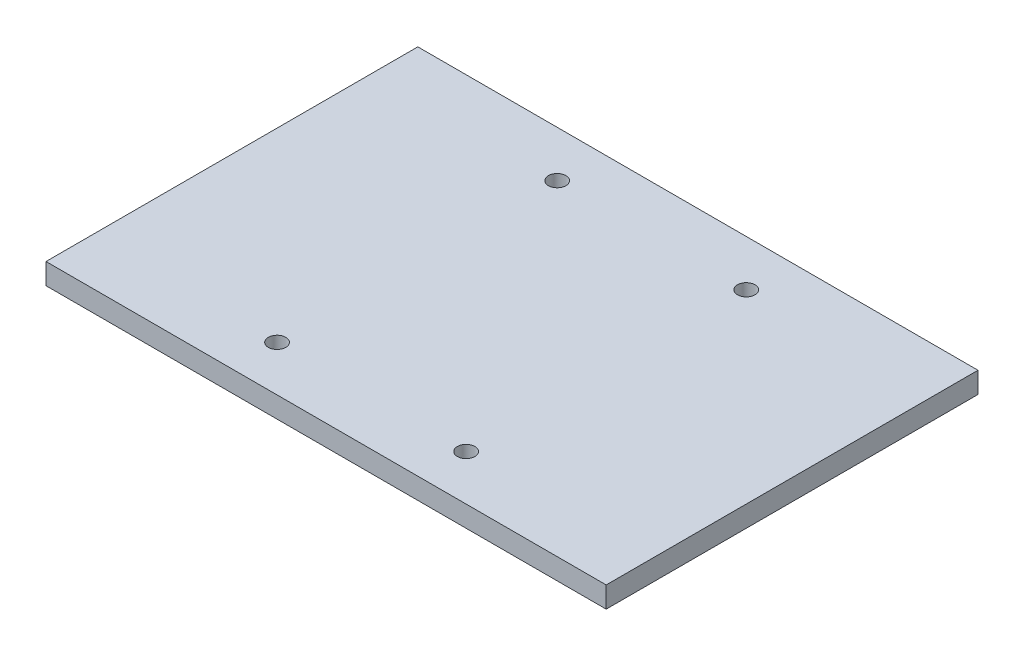
ISO-10303-21;
HEADER;
FILE_DESCRIPTION(('STEP AP214'),'2;1');
FILE_NAME('part.step','',(''),(''),'','','');
FILE_SCHEMA(('AUTOMOTIVE_DESIGN { 1 0 10303 214 1 1 1 1 }'));
ENDSEC;
DATA;
#1=APPLICATION_CONTEXT('core data for automotive mechanical design processes');
#2=APPLICATION_PROTOCOL_DEFINITION('international standard','automotive_design',2000,#1);
#3=PRODUCT_CONTEXT('',#1,'mechanical');
#4=PRODUCT('Part','Part','',(#3));
#5=PRODUCT_RELATED_PRODUCT_CATEGORY('part','',(#4));
#6=PRODUCT_DEFINITION_FORMATION('','',#4);
#7=PRODUCT_DEFINITION_CONTEXT('part definition',#1,'design');
#8=PRODUCT_DEFINITION('design','',#6,#7);
#9=PRODUCT_DEFINITION_SHAPE('','',#8);
#10=(LENGTH_UNIT() NAMED_UNIT(*) SI_UNIT(.MILLI.,.METRE.));
#11=(NAMED_UNIT(*) PLANE_ANGLE_UNIT() SI_UNIT($,.RADIAN.));
#12=(NAMED_UNIT(*) SI_UNIT($,.STERADIAN.) SOLID_ANGLE_UNIT());
#13=UNCERTAINTY_MEASURE_WITH_UNIT(LENGTH_MEASURE(1.E-05),#10,'distance_accuracy_value','');
#14=(GEOMETRIC_REPRESENTATION_CONTEXT(3) GLOBAL_UNCERTAINTY_ASSIGNED_CONTEXT((#13)) GLOBAL_UNIT_ASSIGNED_CONTEXT((#10,
#11,#12)) REPRESENTATION_CONTEXT('',''));
#15=CARTESIAN_POINT('',(0.,0.,0.));
#16=DIRECTION('',(0.,0.,1.));
#17=DIRECTION('',(1.,0.,0.));
#18=AXIS2_PLACEMENT_3D('',#15,#16,#17);
#19=CARTESIAN_POINT('',(0.,3.,0.));
#20=DIRECTION('',(0.,-1.,0.));
#21=DIRECTION('',(0.,0.,-1.));
#22=AXIS2_PLACEMENT_3D('',#19,#20,#21);
#23=PLANE('',#22);
#24=CARTESIAN_POINT('',(26.5,3.,-6.5));
#25=DIRECTION('',(0.,1.,0.));
#26=DIRECTION('',(0.,0.,1.));
#27=AXIS2_PLACEMENT_3D('',#24,#25,#26);
#28=CIRCLE('',#27,1.24999999999999);
#29=CARTESIAN_POINT('',(26.5,3.,-5.25000000000001));
#30=VERTEX_POINT('',#29);
#31=EDGE_CURVE('E135',#30,#30,#28,.T.);
#32=ORIENTED_EDGE('',*,*,#31,.F.);
#33=EDGE_LOOP('',(#32));
#34=FACE_BOUND('',#33,.T.);
#35=CARTESIAN_POINT('',(53.5,3.,-6.5));
#36=DIRECTION('',(0.,1.,0.));
#37=DIRECTION('',(0.,0.,1.));
#38=AXIS2_PLACEMENT_3D('',#35,#36,#37);
#39=CIRCLE('',#38,1.24999999999999);
#40=CARTESIAN_POINT('',(53.5,3.,-5.25000000000001));
#41=VERTEX_POINT('',#40);
#42=EDGE_CURVE('E117',#41,#41,#39,.T.);
#43=ORIENTED_EDGE('',*,*,#42,.F.);
#44=EDGE_LOOP('',(#43));
#45=FACE_BOUND('',#44,.T.);
#46=DIRECTION('',(0.,0.,1.));
#47=VECTOR('',#46,1.);
#48=CARTESIAN_POINT('',(0.,3.,0.));
#49=LINE('',#48,#47);
#50=CARTESIAN_POINT('',(0.,3.,-53.1));
#51=VERTEX_POINT('',#50);
#52=CARTESIAN_POINT('',(0.,3.,0.));
#53=VERTEX_POINT('',#52);
#54=EDGE_CURVE('E89',#51,#53,#49,.T.);
#55=ORIENTED_EDGE('',*,*,#54,.T.);
#56=DIRECTION('',(1.,0.,0.));
#57=VECTOR('',#56,1.);
#58=CARTESIAN_POINT('',(0.,3.,0.));
#59=LINE('',#58,#57);
#60=CARTESIAN_POINT('',(80.,3.,0.));
#61=VERTEX_POINT('',#60);
#62=EDGE_CURVE('E84',#53,#61,#59,.T.);
#63=ORIENTED_EDGE('',*,*,#62,.T.);
#64=DIRECTION('',(0.,0.,-1.));
#65=VECTOR('',#64,1.);
#66=CARTESIAN_POINT('',(80.,3.,0.));
#67=LINE('',#66,#65);
#68=CARTESIAN_POINT('',(80.,3.,-53.1));
#69=VERTEX_POINT('',#68);
#70=EDGE_CURVE('E87',#61,#69,#67,.T.);
#71=ORIENTED_EDGE('',*,*,#70,.T.);
#72=DIRECTION('',(-1.,0.,0.));
#73=VECTOR('',#72,1.);
#74=CARTESIAN_POINT('',(0.,3.,-53.1));
#75=LINE('',#74,#73);
#76=EDGE_CURVE('E54',#69,#51,#75,.T.);
#77=ORIENTED_EDGE('',*,*,#76,.T.);
#78=EDGE_LOOP('',(#55,#63,#71,#77));
#79=FACE_BOUND('',#78,.T.);
#80=CARTESIAN_POINT('',(53.5,3.,-46.5));
#81=DIRECTION('',(0.,1.,0.));
#82=DIRECTION('',(0.,0.,1.));
#83=AXIS2_PLACEMENT_3D('',#80,#81,#82);
#84=CIRCLE('',#83,1.24999999999999);
#85=CARTESIAN_POINT('',(53.5,3.,-45.25));
#86=VERTEX_POINT('',#85);
#87=EDGE_CURVE('E123',#86,#86,#84,.T.);
#88=ORIENTED_EDGE('',*,*,#87,.F.);
#89=EDGE_LOOP('',(#88));
#90=FACE_BOUND('',#89,.T.);
#91=CARTESIAN_POINT('',(26.5,3.,-46.5));
#92=DIRECTION('',(0.,1.,0.));
#93=DIRECTION('',(0.,0.,1.));
#94=AXIS2_PLACEMENT_3D('',#91,#92,#93);
#95=CIRCLE('',#94,1.24999999999999);
#96=CARTESIAN_POINT('',(26.5,3.,-45.25));
#97=VERTEX_POINT('',#96);
#98=EDGE_CURVE('E129',#97,#97,#95,.T.);
#99=ORIENTED_EDGE('',*,*,#98,.F.);
#100=EDGE_LOOP('',(#99));
#101=FACE_BOUND('',#100,.T.);
#102=ADVANCED_FACE('F37',(#34,#45,#79,#90,#101),#23,.F.);
#103=CARTESIAN_POINT('',(0.,3.,0.));
#104=DIRECTION('',(1.,0.,0.));
#105=DIRECTION('',(0.,0.,-1.));
#106=AXIS2_PLACEMENT_3D('',#103,#104,#105);
#107=PLANE('',#106);
#108=DIRECTION('',(0.,0.,1.));
#109=VECTOR('',#108,1.);
#110=CARTESIAN_POINT('',(0.,0.,0.));
#111=LINE('',#110,#109);
#112=CARTESIAN_POINT('',(0.,0.,-53.1));
#113=VERTEX_POINT('',#112);
#114=CARTESIAN_POINT('',(0.,0.,0.));
#115=VERTEX_POINT('',#114);
#116=EDGE_CURVE('E101',#113,#115,#111,.T.);
#117=ORIENTED_EDGE('',*,*,#116,.T.);
#118=DIRECTION('',(0.,-1.,0.));
#119=VECTOR('',#118,1.);
#120=CARTESIAN_POINT('',(0.,3.,0.));
#121=LINE('',#120,#119);
#122=EDGE_CURVE('E11',#53,#115,#121,.T.);
#123=ORIENTED_EDGE('',*,*,#122,.F.);
#124=ORIENTED_EDGE('',*,*,#54,.F.);
#125=DIRECTION('',(0.,-1.,0.));
#126=VECTOR('',#125,1.);
#127=CARTESIAN_POINT('',(0.,3.,-53.1));
#128=LINE('',#127,#126);
#129=EDGE_CURVE('E97',#51,#113,#128,.T.);
#130=ORIENTED_EDGE('',*,*,#129,.T.);
#131=EDGE_LOOP('',(#117,#123,#124,#130));
#132=FACE_BOUND('',#131,.T.);
#133=ADVANCED_FACE('F39',(#132),#107,.F.);
#134=CARTESIAN_POINT('',(0.,3.,0.));
#135=DIRECTION('',(0.,0.,-1.));
#136=DIRECTION('',(-1.,0.,0.));
#137=AXIS2_PLACEMENT_3D('',#134,#135,#136);
#138=PLANE('',#137);
#139=DIRECTION('',(1.,0.,0.));
#140=VECTOR('',#139,1.);
#141=CARTESIAN_POINT('',(0.,0.,0.));
#142=LINE('',#141,#140);
#143=CARTESIAN_POINT('',(80.,0.,0.));
#144=VERTEX_POINT('',#143);
#145=EDGE_CURVE('E93',#115,#144,#142,.T.);
#146=ORIENTED_EDGE('',*,*,#145,.T.);
#147=DIRECTION('',(0.,-1.,0.));
#148=VECTOR('',#147,1.);
#149=CARTESIAN_POINT('',(80.,3.,0.));
#150=LINE('',#149,#148);
#151=EDGE_CURVE('E46',#61,#144,#150,.T.);
#152=ORIENTED_EDGE('',*,*,#151,.F.);
#153=ORIENTED_EDGE('',*,*,#62,.F.);
#154=ORIENTED_EDGE('',*,*,#122,.T.);
#155=EDGE_LOOP('',(#146,#152,#153,#154));
#156=FACE_BOUND('',#155,.T.);
#157=ADVANCED_FACE('F92',(#156),#138,.F.);
#158=CARTESIAN_POINT('',(80.,3.,0.));
#159=DIRECTION('',(-1.,0.,0.));
#160=DIRECTION('',(0.,0.,1.));
#161=AXIS2_PLACEMENT_3D('',#158,#159,#160);
#162=PLANE('',#161);
#163=DIRECTION('',(0.,0.,-1.));
#164=VECTOR('',#163,1.);
#165=CARTESIAN_POINT('',(80.,0.,0.));
#166=LINE('',#165,#164);
#167=CARTESIAN_POINT('',(80.,0.,-53.1));
#168=VERTEX_POINT('',#167);
#169=EDGE_CURVE('E71',#144,#168,#166,.T.);
#170=ORIENTED_EDGE('',*,*,#169,.T.);
#171=DIRECTION('',(0.,-1.,0.));
#172=VECTOR('',#171,1.);
#173=CARTESIAN_POINT('',(80.,3.,-53.1));
#174=LINE('',#173,#172);
#175=EDGE_CURVE('E94',#69,#168,#174,.T.);
#176=ORIENTED_EDGE('',*,*,#175,.F.);
#177=ORIENTED_EDGE('',*,*,#70,.F.);
#178=ORIENTED_EDGE('',*,*,#151,.T.);
#179=EDGE_LOOP('',(#170,#176,#177,#178));
#180=FACE_BOUND('',#179,.T.);
#181=ADVANCED_FACE('F95',(#180),#162,.F.);
#182=CARTESIAN_POINT('',(0.,3.,-53.1));
#183=DIRECTION('',(0.,0.,1.));
#184=DIRECTION('',(1.,0.,0.));
#185=AXIS2_PLACEMENT_3D('',#182,#183,#184);
#186=PLANE('',#185);
#187=DIRECTION('',(-1.,0.,0.));
#188=VECTOR('',#187,1.);
#189=CARTESIAN_POINT('',(0.,0.,-53.1));
#190=LINE('',#189,#188);
#191=EDGE_CURVE('E77',#168,#113,#190,.T.);
#192=ORIENTED_EDGE('',*,*,#191,.T.);
#193=ORIENTED_EDGE('',*,*,#129,.F.);
#194=ORIENTED_EDGE('',*,*,#76,.F.);
#195=ORIENTED_EDGE('',*,*,#175,.T.);
#196=EDGE_LOOP('',(#192,#193,#194,#195));
#197=FACE_BOUND('',#196,.T.);
#198=ADVANCED_FACE('F109',(#197),#186,.F.);
#199=CARTESIAN_POINT('',(0.,0.,0.));
#200=DIRECTION('',(0.,-1.,0.));
#201=DIRECTION('',(0.,0.,-1.));
#202=AXIS2_PLACEMENT_3D('',#199,#200,#201);
#203=PLANE('',#202);
#204=CARTESIAN_POINT('',(26.5,0.,-6.5));
#205=DIRECTION('',(0.,-1.,0.));
#206=DIRECTION('',(0.,0.,-1.));
#207=AXIS2_PLACEMENT_3D('',#204,#205,#206);
#208=CIRCLE('',#207,1.24999999999999);
#209=CARTESIAN_POINT('',(26.5,0.,-7.74999999999999));
#210=VERTEX_POINT('',#209);
#211=EDGE_CURVE('E132',#210,#210,#208,.T.);
#212=ORIENTED_EDGE('',*,*,#211,.F.);
#213=EDGE_LOOP('',(#212));
#214=FACE_BOUND('',#213,.T.);
#215=CARTESIAN_POINT('',(26.5,0.,-46.5));
#216=DIRECTION('',(0.,-1.,0.));
#217=DIRECTION('',(0.,0.,-1.));
#218=AXIS2_PLACEMENT_3D('',#215,#216,#217);
#219=CIRCLE('',#218,1.24999999999999);
#220=CARTESIAN_POINT('',(26.5,0.,-47.75));
#221=VERTEX_POINT('',#220);
#222=EDGE_CURVE('E126',#221,#221,#219,.T.);
#223=ORIENTED_EDGE('',*,*,#222,.F.);
#224=EDGE_LOOP('',(#223));
#225=FACE_BOUND('',#224,.T.);
#226=CARTESIAN_POINT('',(53.5,0.,-46.5));
#227=DIRECTION('',(0.,-1.,0.));
#228=DIRECTION('',(0.,0.,-1.));
#229=AXIS2_PLACEMENT_3D('',#226,#227,#228);
#230=CIRCLE('',#229,1.24999999999999);
#231=CARTESIAN_POINT('',(53.5,0.,-47.75));
#232=VERTEX_POINT('',#231);
#233=EDGE_CURVE('E120',#232,#232,#230,.T.);
#234=ORIENTED_EDGE('',*,*,#233,.F.);
#235=EDGE_LOOP('',(#234));
#236=FACE_BOUND('',#235,.T.);
#237=CARTESIAN_POINT('',(53.5,0.,-6.5));
#238=DIRECTION('',(0.,-1.,0.));
#239=DIRECTION('',(0.,0.,-1.));
#240=AXIS2_PLACEMENT_3D('',#237,#238,#239);
#241=CIRCLE('',#240,1.24999999999999);
#242=CARTESIAN_POINT('',(53.5,0.,-7.74999999999999));
#243=VERTEX_POINT('',#242);
#244=EDGE_CURVE('E104',#243,#243,#241,.T.);
#245=ORIENTED_EDGE('',*,*,#244,.F.);
#246=EDGE_LOOP('',(#245));
#247=FACE_BOUND('',#246,.T.);
#248=ORIENTED_EDGE('',*,*,#116,.F.);
#249=ORIENTED_EDGE('',*,*,#191,.F.);
#250=ORIENTED_EDGE('',*,*,#169,.F.);
#251=ORIENTED_EDGE('',*,*,#145,.F.);
#252=EDGE_LOOP('',(#248,#249,#250,#251));
#253=FACE_BOUND('',#252,.T.);
#254=ADVANCED_FACE('F112',(#214,#225,#236,#247,#253),#203,.T.);
#255=CARTESIAN_POINT('',(53.5,3.,-6.5));
#256=DIRECTION('',(0.,1.,0.));
#257=DIRECTION('',(0.,0.,1.));
#258=AXIS2_PLACEMENT_3D('',#255,#256,#257);
#259=CYLINDRICAL_SURFACE('',#258,1.24999999999999);
#260=ORIENTED_EDGE('',*,*,#42,.T.);
#261=EDGE_LOOP('',(#260));
#262=FACE_BOUND('',#261,.T.);
#263=ORIENTED_EDGE('',*,*,#244,.T.);
#264=EDGE_LOOP('',(#263));
#265=FACE_BOUND('',#264,.T.);
#266=ADVANCED_FACE('F147',(#262,#265),#259,.F.);
#267=CARTESIAN_POINT('',(53.5,3.,-46.5));
#268=DIRECTION('',(0.,1.,0.));
#269=DIRECTION('',(0.,0.,1.));
#270=AXIS2_PLACEMENT_3D('',#267,#268,#269);
#271=CYLINDRICAL_SURFACE('',#270,1.24999999999999);
#272=ORIENTED_EDGE('',*,*,#87,.T.);
#273=EDGE_LOOP('',(#272));
#274=FACE_BOUND('',#273,.T.);
#275=ORIENTED_EDGE('',*,*,#233,.T.);
#276=EDGE_LOOP('',(#275));
#277=FACE_BOUND('',#276,.T.);
#278=ADVANCED_FACE('F150',(#274,#277),#271,.F.);
#279=CARTESIAN_POINT('',(26.5,3.,-46.5));
#280=DIRECTION('',(0.,1.,0.));
#281=DIRECTION('',(0.,0.,1.));
#282=AXIS2_PLACEMENT_3D('',#279,#280,#281);
#283=CYLINDRICAL_SURFACE('',#282,1.24999999999999);
#284=ORIENTED_EDGE('',*,*,#98,.T.);
#285=EDGE_LOOP('',(#284));
#286=FACE_BOUND('',#285,.T.);
#287=ORIENTED_EDGE('',*,*,#222,.T.);
#288=EDGE_LOOP('',(#287));
#289=FACE_BOUND('',#288,.T.);
#290=ADVANCED_FACE('F184',(#286,#289),#283,.F.);
#291=CARTESIAN_POINT('',(26.5,3.,-6.5));
#292=DIRECTION('',(0.,1.,0.));
#293=DIRECTION('',(0.,0.,1.));
#294=AXIS2_PLACEMENT_3D('',#291,#292,#293);
#295=CYLINDRICAL_SURFACE('',#294,1.24999999999999);
#296=ORIENTED_EDGE('',*,*,#31,.T.);
#297=EDGE_LOOP('',(#296));
#298=FACE_BOUND('',#297,.T.);
#299=ORIENTED_EDGE('',*,*,#211,.T.);
#300=EDGE_LOOP('',(#299));
#301=FACE_BOUND('',#300,.T.);
#302=ADVANCED_FACE('F139',(#298,#301),#295,.F.);
#303=CLOSED_SHELL('',(#102,#133,#157,#181,#198,#254,#266,#278,#290,#302));
#304=MANIFOLD_SOLID_BREP('B2',#303);
#305=ADVANCED_BREP_SHAPE_REPRESENTATION('',(#18,#304),#14);
#306=SHAPE_DEFINITION_REPRESENTATION(#9,#305);
ENDSEC;
END-ISO-10303-21;
